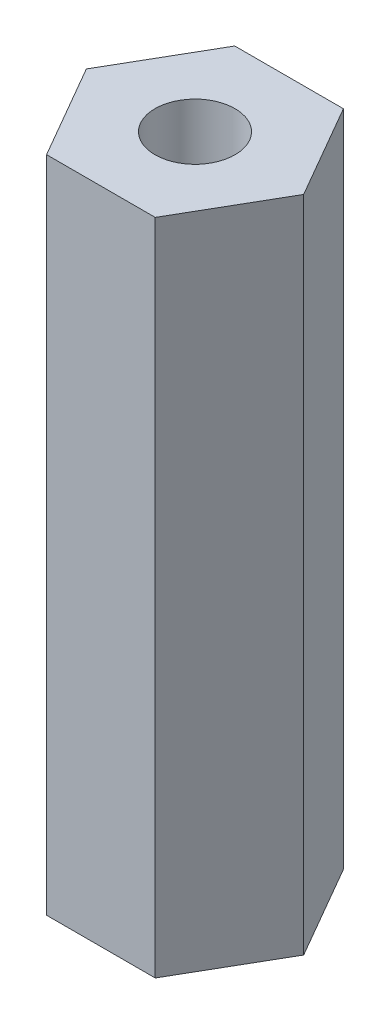
ISO-10303-21;
HEADER;
FILE_DESCRIPTION(('STEP AP214'),'2;1');
FILE_NAME('part.step','',(''),(''),'','','');
FILE_SCHEMA(('AUTOMOTIVE_DESIGN { 1 0 10303 214 1 1 1 1 }'));
ENDSEC;
DATA;
#1=APPLICATION_CONTEXT('core data for automotive mechanical design processes');
#2=APPLICATION_PROTOCOL_DEFINITION('international standard','automotive_design',2000,#1);
#3=PRODUCT_CONTEXT('',#1,'mechanical');
#4=PRODUCT('Part','Part','',(#3));
#5=PRODUCT_RELATED_PRODUCT_CATEGORY('part','',(#4));
#6=PRODUCT_DEFINITION_FORMATION('','',#4);
#7=PRODUCT_DEFINITION_CONTEXT('part definition',#1,'design');
#8=PRODUCT_DEFINITION('design','',#6,#7);
#9=PRODUCT_DEFINITION_SHAPE('','',#8);
#10=(LENGTH_UNIT() NAMED_UNIT(*) SI_UNIT(.MILLI.,.METRE.));
#11=(NAMED_UNIT(*) PLANE_ANGLE_UNIT() SI_UNIT($,.RADIAN.));
#12=(NAMED_UNIT(*) SI_UNIT($,.STERADIAN.) SOLID_ANGLE_UNIT());
#13=UNCERTAINTY_MEASURE_WITH_UNIT(LENGTH_MEASURE(1.E-05),#10,'distance_accuracy_value','');
#14=(GEOMETRIC_REPRESENTATION_CONTEXT(3) GLOBAL_UNCERTAINTY_ASSIGNED_CONTEXT((#13)) GLOBAL_UNIT_ASSIGNED_CONTEXT((#10,
#11,#12)) REPRESENTATION_CONTEXT('',''));
#15=CARTESIAN_POINT('',(0.,0.,0.));
#16=DIRECTION('',(0.,0.,1.));
#17=DIRECTION('',(1.,0.,0.));
#18=AXIS2_PLACEMENT_3D('',#15,#16,#17);
#19=CARTESIAN_POINT('',(5.77350269189626,-70.,10.));
#20=DIRECTION('',(0.866025403784439,0.,0.5));
#21=DIRECTION('',(0.5,0.,-0.866025403784439));
#22=AXIS2_PLACEMENT_3D('',#19,#20,#21);
#23=PLANE('',#22);
#24=DIRECTION('',(0.5,0.,-0.866025403784439));
#25=VECTOR('',#24,1.);
#26=CARTESIAN_POINT('',(5.77350269189626,0.,10.));
#27=LINE('',#26,#25);
#28=CARTESIAN_POINT('',(5.77350269189626,0.,10.));
#29=VERTEX_POINT('',#28);
#30=CARTESIAN_POINT('',(11.5470053837925,0.,0.));
#31=VERTEX_POINT('',#30);
#32=EDGE_CURVE('E122',#29,#31,#27,.T.);
#33=ORIENTED_EDGE('',*,*,#32,.F.);
#34=DIRECTION('',(0.,1.,0.));
#35=VECTOR('',#34,1.);
#36=CARTESIAN_POINT('',(5.77350269189626,-70.,10.));
#37=LINE('',#36,#35);
#38=CARTESIAN_POINT('',(5.77350269189626,-70.,10.));
#39=VERTEX_POINT('',#38);
#40=EDGE_CURVE('E11',#39,#29,#37,.T.);
#41=ORIENTED_EDGE('',*,*,#40,.F.);
#42=DIRECTION('',(0.5,0.,-0.866025403784439));
#43=VECTOR('',#42,1.);
#44=CARTESIAN_POINT('',(5.77350269189626,-70.,10.));
#45=LINE('',#44,#43);
#46=CARTESIAN_POINT('',(11.5470053837925,-70.,0.));
#47=VERTEX_POINT('',#46);
#48=EDGE_CURVE('E137',#39,#47,#45,.T.);
#49=ORIENTED_EDGE('',*,*,#48,.T.);
#50=DIRECTION('',(0.,1.,0.));
#51=VECTOR('',#50,1.);
#52=CARTESIAN_POINT('',(11.5470053837925,-70.,0.));
#53=LINE('',#52,#51);
#54=EDGE_CURVE('E40',#47,#31,#53,.T.);
#55=ORIENTED_EDGE('',*,*,#54,.T.);
#56=EDGE_LOOP('',(#33,#41,#49,#55));
#57=FACE_BOUND('',#56,.T.);
#58=ADVANCED_FACE('F37',(#57),#23,.T.);
#59=CARTESIAN_POINT('',(-5.77350269189626,-70.,10.));
#60=DIRECTION('',(0.,0.,1.));
#61=DIRECTION('',(1.,0.,0.));
#62=AXIS2_PLACEMENT_3D('',#59,#60,#61);
#63=PLANE('',#62);
#64=DIRECTION('',(1.,0.,0.));
#65=VECTOR('',#64,1.);
#66=CARTESIAN_POINT('',(-5.77350269189626,0.,10.));
#67=LINE('',#66,#65);
#68=CARTESIAN_POINT('',(-5.77350269189626,0.,10.));
#69=VERTEX_POINT('',#68);
#70=EDGE_CURVE('E135',#69,#29,#67,.T.);
#71=ORIENTED_EDGE('',*,*,#70,.F.);
#72=DIRECTION('',(0.,1.,0.));
#73=VECTOR('',#72,1.);
#74=CARTESIAN_POINT('',(-5.77350269189626,-70.,10.));
#75=LINE('',#74,#73);
#76=CARTESIAN_POINT('',(-5.77350269189626,-70.,10.));
#77=VERTEX_POINT('',#76);
#78=EDGE_CURVE('E46',#77,#69,#75,.T.);
#79=ORIENTED_EDGE('',*,*,#78,.F.);
#80=DIRECTION('',(1.,0.,0.));
#81=VECTOR('',#80,1.);
#82=CARTESIAN_POINT('',(-5.77350269189626,-70.,10.));
#83=LINE('',#82,#81);
#84=EDGE_CURVE('E112',#77,#39,#83,.T.);
#85=ORIENTED_EDGE('',*,*,#84,.T.);
#86=ORIENTED_EDGE('',*,*,#40,.T.);
#87=EDGE_LOOP('',(#71,#79,#85,#86));
#88=FACE_BOUND('',#87,.T.);
#89=ADVANCED_FACE('F145',(#88),#63,.T.);
#90=CARTESIAN_POINT('',(-11.5470053837925,-70.,0.));
#91=DIRECTION('',(-0.866025403784439,0.,0.5));
#92=DIRECTION('',(0.5,0.,0.866025403784439));
#93=AXIS2_PLACEMENT_3D('',#90,#91,#92);
#94=PLANE('',#93);
#95=DIRECTION('',(0.5,0.,0.866025403784438));
#96=VECTOR('',#95,1.);
#97=CARTESIAN_POINT('',(-11.5470053837925,0.,0.));
#98=LINE('',#97,#96);
#99=CARTESIAN_POINT('',(-11.5470053837925,0.,0.));
#100=VERTEX_POINT('',#99);
#101=EDGE_CURVE('E99',#100,#69,#98,.T.);
#102=ORIENTED_EDGE('',*,*,#101,.F.);
#103=DIRECTION('',(0.,1.,0.));
#104=VECTOR('',#103,1.);
#105=CARTESIAN_POINT('',(-11.5470053837925,-70.,0.));
#106=LINE('',#105,#104);
#107=CARTESIAN_POINT('',(-11.5470053837925,-70.,0.));
#108=VERTEX_POINT('',#107);
#109=EDGE_CURVE('E94',#108,#100,#106,.T.);
#110=ORIENTED_EDGE('',*,*,#109,.F.);
#111=DIRECTION('',(0.5,0.,0.866025403784438));
#112=VECTOR('',#111,1.);
#113=CARTESIAN_POINT('',(-11.5470053837925,-70.,0.));
#114=LINE('',#113,#112);
#115=EDGE_CURVE('E97',#108,#77,#114,.T.);
#116=ORIENTED_EDGE('',*,*,#115,.T.);
#117=ORIENTED_EDGE('',*,*,#78,.T.);
#118=EDGE_LOOP('',(#102,#110,#116,#117));
#119=FACE_BOUND('',#118,.T.);
#120=ADVANCED_FACE('F96',(#119),#94,.T.);
#121=CARTESIAN_POINT('',(-5.77350269189626,-70.,-10.));
#122=DIRECTION('',(-0.866025403784439,0.,-0.5));
#123=DIRECTION('',(-0.5,0.,0.866025403784439));
#124=AXIS2_PLACEMENT_3D('',#121,#122,#123);
#125=PLANE('',#124);
#126=DIRECTION('',(-0.5,0.,0.866025403784439));
#127=VECTOR('',#126,1.);
#128=CARTESIAN_POINT('',(-5.77350269189626,0.,-10.));
#129=LINE('',#128,#127);
#130=CARTESIAN_POINT('',(-5.77350269189626,0.,-10.));
#131=VERTEX_POINT('',#130);
#132=EDGE_CURVE('E132',#131,#100,#129,.T.);
#133=ORIENTED_EDGE('',*,*,#132,.F.);
#134=DIRECTION('',(0.,1.,0.));
#135=VECTOR('',#134,1.);
#136=CARTESIAN_POINT('',(-5.77350269189626,-70.,-10.));
#137=LINE('',#136,#135);
#138=CARTESIAN_POINT('',(-5.77350269189626,-70.,-10.));
#139=VERTEX_POINT('',#138);
#140=EDGE_CURVE('E104',#139,#131,#137,.T.);
#141=ORIENTED_EDGE('',*,*,#140,.F.);
#142=DIRECTION('',(-0.5,0.,0.866025403784439));
#143=VECTOR('',#142,1.);
#144=CARTESIAN_POINT('',(-5.77350269189626,-70.,-10.));
#145=LINE('',#144,#143);
#146=EDGE_CURVE('E110',#139,#108,#145,.T.);
#147=ORIENTED_EDGE('',*,*,#146,.T.);
#148=ORIENTED_EDGE('',*,*,#109,.T.);
#149=EDGE_LOOP('',(#133,#141,#147,#148));
#150=FACE_BOUND('',#149,.T.);
#151=ADVANCED_FACE('F114',(#150),#125,.T.);
#152=CARTESIAN_POINT('',(5.77350269189625,-70.,-10.));
#153=DIRECTION('',(0.,0.,-1.));
#154=DIRECTION('',(-1.,0.,0.));
#155=AXIS2_PLACEMENT_3D('',#152,#153,#154);
#156=PLANE('',#155);
#157=DIRECTION('',(-1.,0.,0.));
#158=VECTOR('',#157,1.);
#159=CARTESIAN_POINT('',(5.77350269189625,0.,-10.));
#160=LINE('',#159,#158);
#161=CARTESIAN_POINT('',(5.77350269189625,0.,-10.));
#162=VERTEX_POINT('',#161);
#163=EDGE_CURVE('E129',#162,#131,#160,.T.);
#164=ORIENTED_EDGE('',*,*,#163,.F.);
#165=DIRECTION('',(0.,1.,0.));
#166=VECTOR('',#165,1.);
#167=CARTESIAN_POINT('',(5.77350269189625,-70.,-10.));
#168=LINE('',#167,#166);
#169=CARTESIAN_POINT('',(5.77350269189625,-70.,-10.));
#170=VERTEX_POINT('',#169);
#171=EDGE_CURVE('E140',#170,#162,#168,.T.);
#172=ORIENTED_EDGE('',*,*,#171,.F.);
#173=DIRECTION('',(-1.,0.,0.));
#174=VECTOR('',#173,1.);
#175=CARTESIAN_POINT('',(5.77350269189625,-70.,-10.));
#176=LINE('',#175,#174);
#177=EDGE_CURVE('E115',#170,#139,#176,.T.);
#178=ORIENTED_EDGE('',*,*,#177,.T.);
#179=ORIENTED_EDGE('',*,*,#140,.T.);
#180=EDGE_LOOP('',(#164,#172,#178,#179));
#181=FACE_BOUND('',#180,.T.);
#182=ADVANCED_FACE('F158',(#181),#156,.T.);
#183=CARTESIAN_POINT('',(11.5470053837925,-70.,0.));
#184=DIRECTION('',(0.866025403784438,0.,-0.5));
#185=DIRECTION('',(-0.5,0.,-0.866025403784438));
#186=AXIS2_PLACEMENT_3D('',#183,#184,#185);
#187=PLANE('',#186);
#188=DIRECTION('',(-0.5,0.,-0.866025403784438));
#189=VECTOR('',#188,1.);
#190=CARTESIAN_POINT('',(11.5470053837925,0.,0.));
#191=LINE('',#190,#189);
#192=EDGE_CURVE('E125',#31,#162,#191,.T.);
#193=ORIENTED_EDGE('',*,*,#192,.F.);
#194=ORIENTED_EDGE('',*,*,#54,.F.);
#195=DIRECTION('',(-0.5,0.,-0.866025403784438));
#196=VECTOR('',#195,1.);
#197=CARTESIAN_POINT('',(11.5470053837925,-70.,0.));
#198=LINE('',#197,#196);
#199=EDGE_CURVE('E117',#47,#170,#198,.T.);
#200=ORIENTED_EDGE('',*,*,#199,.T.);
#201=ORIENTED_EDGE('',*,*,#171,.T.);
#202=EDGE_LOOP('',(#193,#194,#200,#201));
#203=FACE_BOUND('',#202,.T.);
#204=ADVANCED_FACE('F142',(#203),#187,.T.);
#205=CARTESIAN_POINT('',(0.,-70.,0.));
#206=DIRECTION('',(0.,1.,0.));
#207=DIRECTION('',(0.,0.,1.));
#208=AXIS2_PLACEMENT_3D('',#205,#206,#207);
#209=PLANE('',#208);
#210=CARTESIAN_POINT('',(0.,-70.,0.));
#211=DIRECTION('',(0.,1.,0.));
#212=DIRECTION('',(0.,0.,1.));
#213=AXIS2_PLACEMENT_3D('',#210,#211,#212);
#214=CIRCLE('',#213,4.25);
#215=CARTESIAN_POINT('',(0.,-70.,4.25));
#216=VERTEX_POINT('',#215);
#217=EDGE_CURVE('E126',#216,#216,#214,.T.);
#218=ORIENTED_EDGE('',*,*,#217,.T.);
#219=EDGE_LOOP('',(#218));
#220=FACE_BOUND('',#219,.T.);
#221=ORIENTED_EDGE('',*,*,#48,.F.);
#222=ORIENTED_EDGE('',*,*,#84,.F.);
#223=ORIENTED_EDGE('',*,*,#115,.F.);
#224=ORIENTED_EDGE('',*,*,#146,.F.);
#225=ORIENTED_EDGE('',*,*,#177,.F.);
#226=ORIENTED_EDGE('',*,*,#199,.F.);
#227=EDGE_LOOP('',(#221,#222,#223,#224,#225,#226));
#228=FACE_BOUND('',#227,.T.);
#229=ADVANCED_FACE('F108',(#220,#228),#209,.F.);
#230=CARTESIAN_POINT('',(0.,0.,0.));
#231=DIRECTION('',(0.,1.,0.));
#232=DIRECTION('',(0.,0.,1.));
#233=AXIS2_PLACEMENT_3D('',#230,#231,#232);
#234=PLANE('',#233);
#235=CARTESIAN_POINT('',(0.,0.,0.));
#236=DIRECTION('',(0.,1.,0.));
#237=DIRECTION('',(0.,0.,1.));
#238=AXIS2_PLACEMENT_3D('',#235,#236,#237);
#239=CIRCLE('',#238,4.25);
#240=CARTESIAN_POINT('',(0.,0.,4.25));
#241=VERTEX_POINT('',#240);
#242=EDGE_CURVE('E181',#241,#241,#239,.T.);
#243=ORIENTED_EDGE('',*,*,#242,.F.);
#244=EDGE_LOOP('',(#243));
#245=FACE_BOUND('',#244,.T.);
#246=ORIENTED_EDGE('',*,*,#32,.T.);
#247=ORIENTED_EDGE('',*,*,#192,.T.);
#248=ORIENTED_EDGE('',*,*,#163,.T.);
#249=ORIENTED_EDGE('',*,*,#132,.T.);
#250=ORIENTED_EDGE('',*,*,#101,.T.);
#251=ORIENTED_EDGE('',*,*,#70,.T.);
#252=EDGE_LOOP('',(#246,#247,#248,#249,#250,#251));
#253=FACE_BOUND('',#252,.T.);
#254=ADVANCED_FACE('F144',(#245,#253),#234,.T.);
#255=CARTESIAN_POINT('',(0.,-70.,0.));
#256=DIRECTION('',(0.,1.,0.));
#257=DIRECTION('',(0.,0.,1.));
#258=AXIS2_PLACEMENT_3D('',#255,#256,#257);
#259=CYLINDRICAL_SURFACE('',#258,4.25);
#260=ORIENTED_EDGE('',*,*,#217,.F.);
#261=EDGE_LOOP('',(#260));
#262=FACE_BOUND('',#261,.T.);
#263=ORIENTED_EDGE('',*,*,#242,.T.);
#264=EDGE_LOOP('',(#263));
#265=FACE_BOUND('',#264,.T.);
#266=ADVANCED_FACE('F169',(#262,#265),#259,.F.);
#267=CLOSED_SHELL('',(#58,#89,#120,#151,#182,#204,#229,#254,#266));
#268=MANIFOLD_SOLID_BREP('B2',#267);
#269=ADVANCED_BREP_SHAPE_REPRESENTATION('',(#18,#268),#14);
#270=SHAPE_DEFINITION_REPRESENTATION(#9,#269);
ENDSEC;
END-ISO-10303-21;
